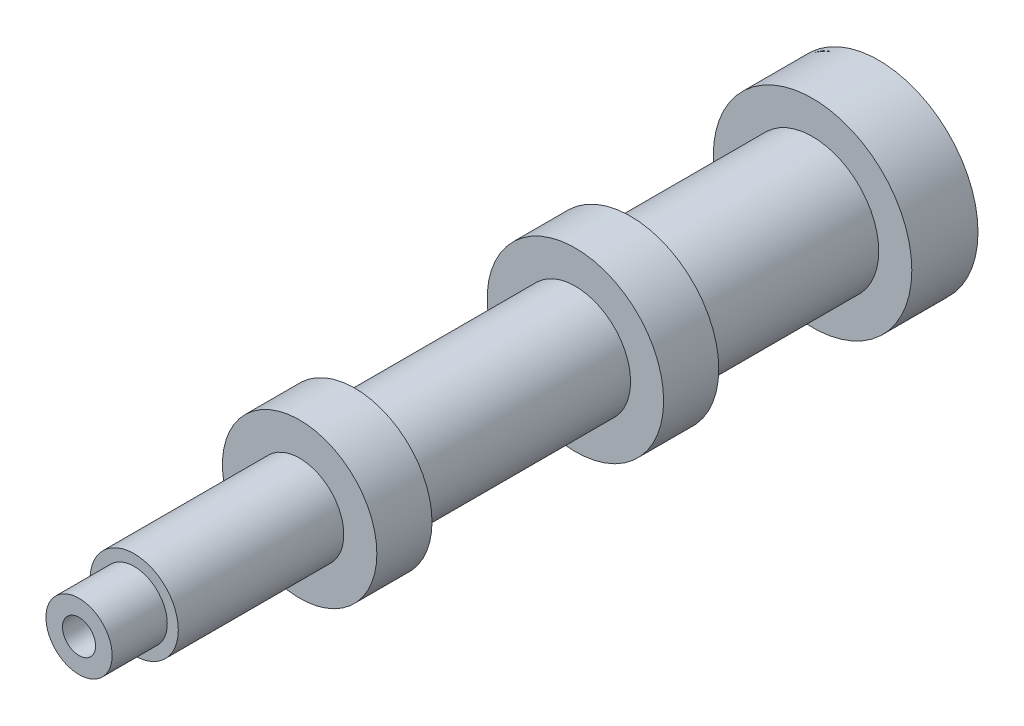
ISO-10303-21;
HEADER;
FILE_DESCRIPTION(('STEP AP214'),'2;1');
FILE_NAME('part.step','',(''),(''),'','','');
FILE_SCHEMA(('AUTOMOTIVE_DESIGN { 1 0 10303 214 1 1 1 1 }'));
ENDSEC;
DATA;
#1=APPLICATION_CONTEXT('core data for automotive mechanical design processes');
#2=APPLICATION_PROTOCOL_DEFINITION('international standard','automotive_design',2000,#1);
#3=PRODUCT_CONTEXT('',#1,'mechanical');
#4=PRODUCT('Part','Part','',(#3));
#5=PRODUCT_RELATED_PRODUCT_CATEGORY('part','',(#4));
#6=PRODUCT_DEFINITION_FORMATION('','',#4);
#7=PRODUCT_DEFINITION_CONTEXT('part definition',#1,'design');
#8=PRODUCT_DEFINITION('design','',#6,#7);
#9=PRODUCT_DEFINITION_SHAPE('','',#8);
#10=(LENGTH_UNIT() NAMED_UNIT(*) SI_UNIT(.MILLI.,.METRE.));
#11=(NAMED_UNIT(*) PLANE_ANGLE_UNIT() SI_UNIT($,.RADIAN.));
#12=(NAMED_UNIT(*) SI_UNIT($,.STERADIAN.) SOLID_ANGLE_UNIT());
#13=UNCERTAINTY_MEASURE_WITH_UNIT(LENGTH_MEASURE(1.E-05),#10,'distance_accuracy_value','');
#14=(GEOMETRIC_REPRESENTATION_CONTEXT(3) GLOBAL_UNCERTAINTY_ASSIGNED_CONTEXT((#13)) GLOBAL_UNIT_ASSIGNED_CONTEXT((#10,
#11,#12)) REPRESENTATION_CONTEXT('',''));
#15=CARTESIAN_POINT('',(0.,0.,0.));
#16=DIRECTION('',(0.,0.,1.));
#17=DIRECTION('',(1.,0.,0.));
#18=AXIS2_PLACEMENT_3D('',#15,#16,#17);
#19=CARTESIAN_POINT('',(0.,0.,95.));
#20=DIRECTION('',(0.,0.,1.));
#21=DIRECTION('',(1.,0.,0.));
#22=AXIS2_PLACEMENT_3D('',#19,#20,#21);
#23=PLANE('',#22);
#24=CARTESIAN_POINT('',(0.,0.,95.));
#25=DIRECTION('',(0.,0.,1.));
#26=DIRECTION('',(1.,0.,0.));
#27=AXIS2_PLACEMENT_3D('',#24,#25,#26);
#28=CIRCLE('',#27,14.);
#29=CARTESIAN_POINT('',(14.,0.,95.));
#30=VERTEX_POINT('',#29);
#31=EDGE_CURVE('E24',#30,#30,#28,.T.);
#32=ORIENTED_EDGE('',*,*,#31,.F.);
#33=EDGE_LOOP('',(#32));
#34=FACE_BOUND('',#33,.T.);
#35=CARTESIAN_POINT('',(0.,0.,95.));
#36=DIRECTION('',(0.,0.,1.));
#37=DIRECTION('',(1.,0.,0.));
#38=AXIS2_PLACEMENT_3D('',#35,#36,#37);
#39=CIRCLE('',#38,10.);
#40=CARTESIAN_POINT('',(10.,0.,95.));
#41=VERTEX_POINT('',#40);
#42=EDGE_CURVE('E41',#41,#41,#39,.T.);
#43=ORIENTED_EDGE('',*,*,#42,.T.);
#44=EDGE_LOOP('',(#43));
#45=FACE_BOUND('',#44,.T.);
#46=ADVANCED_FACE('F16',(#34,#45),#23,.F.);
#47=CARTESIAN_POINT('',(0.,0.,95.));
#48=DIRECTION('',(0.,0.,1.));
#49=DIRECTION('',(1.,0.,0.));
#50=AXIS2_PLACEMENT_3D('',#47,#48,#49);
#51=CYLINDRICAL_SURFACE('',#50,14.);
#52=ORIENTED_EDGE('',*,*,#31,.T.);
#53=DIRECTION('',(0.,0.,1.));
#54=VECTOR('',#53,1.);
#55=CARTESIAN_POINT('',(14.,0.,95.));
#56=LINE('',#55,#54);
#57=CARTESIAN_POINT('',(14.,0.,105.));
#58=VERTEX_POINT('',#57);
#59=EDGE_CURVE('E10',#30,#58,#56,.T.);
#60=ORIENTED_EDGE('',*,*,#59,.T.);
#61=CARTESIAN_POINT('',(0.,0.,105.));
#62=DIRECTION('',(0.,0.,1.));
#63=DIRECTION('',(1.,0.,0.));
#64=AXIS2_PLACEMENT_3D('',#61,#62,#63);
#65=CIRCLE('',#64,14.);
#66=EDGE_CURVE('E150',#58,#58,#65,.T.);
#67=ORIENTED_EDGE('',*,*,#66,.F.);
#68=ORIENTED_EDGE('',*,*,#59,.F.);
#69=EDGE_LOOP('',(#52,#60,#67,#68));
#70=FACE_BOUND('',#69,.T.);
#71=ADVANCED_FACE('F274',(#70),#51,.T.);
#72=CARTESIAN_POINT('',(0.,0.,55.));
#73=DIRECTION('',(0.,0.,1.));
#74=DIRECTION('',(1.,0.,0.));
#75=AXIS2_PLACEMENT_3D('',#72,#73,#74);
#76=CYLINDRICAL_SURFACE('',#75,10.);
#77=CARTESIAN_POINT('',(0.,0.,55.));
#78=DIRECTION('',(0.,0.,1.));
#79=DIRECTION('',(1.,0.,0.));
#80=AXIS2_PLACEMENT_3D('',#77,#78,#79);
#81=CIRCLE('',#80,10.);
#82=CARTESIAN_POINT('',(10.,0.,55.));
#83=VERTEX_POINT('',#82);
#84=EDGE_CURVE('E154',#83,#83,#81,.T.);
#85=ORIENTED_EDGE('',*,*,#84,.T.);
#86=DIRECTION('',(0.,0.,1.));
#87=VECTOR('',#86,1.);
#88=CARTESIAN_POINT('',(10.,0.,55.));
#89=LINE('',#88,#87);
#90=EDGE_CURVE('E153',#83,#41,#89,.T.);
#91=ORIENTED_EDGE('',*,*,#90,.T.);
#92=ORIENTED_EDGE('',*,*,#42,.F.);
#93=ORIENTED_EDGE('',*,*,#90,.F.);
#94=EDGE_LOOP('',(#85,#91,#92,#93));
#95=FACE_BOUND('',#94,.T.);
#96=ADVANCED_FACE('F281',(#95),#76,.T.);
#97=CARTESIAN_POINT('',(0.,0.,105.));
#98=DIRECTION('',(0.,0.,1.));
#99=DIRECTION('',(1.,0.,0.));
#100=AXIS2_PLACEMENT_3D('',#97,#98,#99);
#101=PLANE('',#100);
#102=CARTESIAN_POINT('',(0.,0.,105.));
#103=DIRECTION('',(0.,0.,1.));
#104=DIRECTION('',(1.,0.,0.));
#105=AXIS2_PLACEMENT_3D('',#102,#103,#104);
#106=CIRCLE('',#105,8.);
#107=CARTESIAN_POINT('',(8.,0.,105.));
#108=VERTEX_POINT('',#107);
#109=EDGE_CURVE('E245',#108,#108,#106,.T.);
#110=ORIENTED_EDGE('',*,*,#109,.F.);
#111=EDGE_LOOP('',(#110));
#112=FACE_BOUND('',#111,.T.);
#113=ORIENTED_EDGE('',*,*,#66,.T.);
#114=EDGE_LOOP('',(#113));
#115=FACE_BOUND('',#114,.T.);
#116=ADVANCED_FACE('F285',(#112,#115),#101,.T.);
#117=CARTESIAN_POINT('',(0.,0.,55.));
#118=DIRECTION('',(0.,0.,1.));
#119=DIRECTION('',(1.,0.,0.));
#120=AXIS2_PLACEMENT_3D('',#117,#118,#119);
#121=PLANE('',#120);
#122=ORIENTED_EDGE('',*,*,#84,.F.);
#123=EDGE_LOOP('',(#122));
#124=FACE_BOUND('',#123,.T.);
#125=CARTESIAN_POINT('',(0.,0.,55.));
#126=DIRECTION('',(0.,0.,1.));
#127=DIRECTION('',(1.,0.,0.));
#128=AXIS2_PLACEMENT_3D('',#125,#126,#127);
#129=CIRCLE('',#128,16.);
#130=CARTESIAN_POINT('',(16.,0.,55.));
#131=VERTEX_POINT('',#130);
#132=EDGE_CURVE('E250',#131,#131,#129,.T.);
#133=ORIENTED_EDGE('',*,*,#132,.T.);
#134=EDGE_LOOP('',(#133));
#135=FACE_BOUND('',#134,.T.);
#136=ADVANCED_FACE('F291',(#124,#135),#121,.T.);
#137=CARTESIAN_POINT('',(0.,0.,105.));
#138=DIRECTION('',(0.,0.,1.));
#139=DIRECTION('',(1.,0.,0.));
#140=AXIS2_PLACEMENT_3D('',#137,#138,#139);
#141=CYLINDRICAL_SURFACE('',#140,8.);
#142=ORIENTED_EDGE('',*,*,#109,.T.);
#143=DIRECTION('',(0.,0.,1.));
#144=VECTOR('',#143,1.);
#145=CARTESIAN_POINT('',(8.,0.,105.));
#146=LINE('',#145,#144);
#147=CARTESIAN_POINT('',(8.,0.,135.));
#148=VERTEX_POINT('',#147);
#149=EDGE_CURVE('E249',#108,#148,#146,.T.);
#150=ORIENTED_EDGE('',*,*,#149,.T.);
#151=CARTESIAN_POINT('',(0.,0.,135.));
#152=DIRECTION('',(0.,0.,1.));
#153=DIRECTION('',(1.,0.,0.));
#154=AXIS2_PLACEMENT_3D('',#151,#152,#153);
#155=CIRCLE('',#154,8.);
#156=EDGE_CURVE('E257',#148,#148,#155,.T.);
#157=ORIENTED_EDGE('',*,*,#156,.F.);
#158=ORIENTED_EDGE('',*,*,#149,.F.);
#159=EDGE_LOOP('',(#142,#150,#157,#158));
#160=FACE_BOUND('',#159,.T.);
#161=ADVANCED_FACE('F293',(#160),#141,.T.);
#162=CARTESIAN_POINT('',(0.,0.,45.));
#163=DIRECTION('',(0.,0.,1.));
#164=DIRECTION('',(1.,0.,0.));
#165=AXIS2_PLACEMENT_3D('',#162,#163,#164);
#166=CYLINDRICAL_SURFACE('',#165,16.);
#167=CARTESIAN_POINT('',(0.,0.,45.));
#168=DIRECTION('',(0.,0.,1.));
#169=DIRECTION('',(1.,0.,0.));
#170=AXIS2_PLACEMENT_3D('',#167,#168,#169);
#171=CIRCLE('',#170,16.);
#172=CARTESIAN_POINT('',(16.,0.,45.));
#173=VERTEX_POINT('',#172);
#174=EDGE_CURVE('E253',#173,#173,#171,.T.);
#175=ORIENTED_EDGE('',*,*,#174,.T.);
#176=DIRECTION('',(0.,0.,1.));
#177=VECTOR('',#176,1.);
#178=CARTESIAN_POINT('',(16.,0.,45.));
#179=LINE('',#178,#177);
#180=EDGE_CURVE('E261',#173,#131,#179,.T.);
#181=ORIENTED_EDGE('',*,*,#180,.T.);
#182=ORIENTED_EDGE('',*,*,#132,.F.);
#183=ORIENTED_EDGE('',*,*,#180,.F.);
#184=EDGE_LOOP('',(#175,#181,#182,#183));
#185=FACE_BOUND('',#184,.T.);
#186=ADVANCED_FACE('F296',(#185),#166,.T.);
#187=CARTESIAN_POINT('',(0.,0.,135.));
#188=DIRECTION('',(0.,0.,1.));
#189=DIRECTION('',(1.,0.,0.));
#190=AXIS2_PLACEMENT_3D('',#187,#188,#189);
#191=PLANE('',#190);
#192=CARTESIAN_POINT('',(0.,0.,135.));
#193=DIRECTION('',(0.,0.,1.));
#194=DIRECTION('',(1.,0.,0.));
#195=AXIS2_PLACEMENT_3D('',#192,#193,#194);
#196=CIRCLE('',#195,6.);
#197=CARTESIAN_POINT('',(6.,0.,135.));
#198=VERTEX_POINT('',#197);
#199=EDGE_CURVE('E240',#198,#198,#196,.T.);
#200=ORIENTED_EDGE('',*,*,#199,.F.);
#201=EDGE_LOOP('',(#200));
#202=FACE_BOUND('',#201,.T.);
#203=ORIENTED_EDGE('',*,*,#156,.T.);
#204=EDGE_LOOP('',(#203));
#205=FACE_BOUND('',#204,.T.);
#206=ADVANCED_FACE('F298',(#202,#205),#191,.T.);
#207=CARTESIAN_POINT('',(0.,0.,45.));
#208=DIRECTION('',(0.,0.,1.));
#209=DIRECTION('',(1.,0.,0.));
#210=AXIS2_PLACEMENT_3D('',#207,#208,#209);
#211=PLANE('',#210);
#212=ORIENTED_EDGE('',*,*,#174,.F.);
#213=EDGE_LOOP('',(#212));
#214=FACE_BOUND('',#213,.T.);
#215=CARTESIAN_POINT('',(0.,0.,45.));
#216=DIRECTION('',(0.,0.,1.));
#217=DIRECTION('',(1.,0.,0.));
#218=AXIS2_PLACEMENT_3D('',#215,#216,#217);
#219=CIRCLE('',#218,12.);
#220=CARTESIAN_POINT('',(12.,0.,45.));
#221=VERTEX_POINT('',#220);
#222=EDGE_CURVE('E237',#221,#221,#219,.T.);
#223=ORIENTED_EDGE('',*,*,#222,.T.);
#224=EDGE_LOOP('',(#223));
#225=FACE_BOUND('',#224,.T.);
#226=ADVANCED_FACE('F301',(#214,#225),#211,.F.);
#227=CARTESIAN_POINT('',(0.,0.,135.));
#228=DIRECTION('',(0.,0.,1.));
#229=DIRECTION('',(1.,0.,0.));
#230=AXIS2_PLACEMENT_3D('',#227,#228,#229);
#231=CYLINDRICAL_SURFACE('',#230,6.);
#232=ORIENTED_EDGE('',*,*,#199,.T.);
#233=DIRECTION('',(0.,0.,1.));
#234=VECTOR('',#233,1.);
#235=CARTESIAN_POINT('',(6.,0.,135.));
#236=LINE('',#235,#234);
#237=CARTESIAN_POINT('',(6.,0.,145.));
#238=VERTEX_POINT('',#237);
#239=EDGE_CURVE('E244',#198,#238,#236,.T.);
#240=ORIENTED_EDGE('',*,*,#239,.T.);
#241=CARTESIAN_POINT('',(0.,0.,145.));
#242=DIRECTION('',(0.,0.,1.));
#243=DIRECTION('',(1.,0.,0.));
#244=AXIS2_PLACEMENT_3D('',#241,#242,#243);
#245=CIRCLE('',#244,6.);
#246=EDGE_CURVE('E207',#238,#238,#245,.T.);
#247=ORIENTED_EDGE('',*,*,#246,.F.);
#248=ORIENTED_EDGE('',*,*,#239,.F.);
#249=EDGE_LOOP('',(#232,#240,#247,#248));
#250=FACE_BOUND('',#249,.T.);
#251=ADVANCED_FACE('F310',(#250),#231,.T.);
#252=CARTESIAN_POINT('',(0.,0.,12.));
#253=DIRECTION('',(0.,0.,1.));
#254=DIRECTION('',(1.,0.,0.));
#255=AXIS2_PLACEMENT_3D('',#252,#253,#254);
#256=CYLINDRICAL_SURFACE('',#255,12.);
#257=CARTESIAN_POINT('',(0.,0.,12.));
#258=DIRECTION('',(0.,0.,1.));
#259=DIRECTION('',(1.,0.,0.));
#260=AXIS2_PLACEMENT_3D('',#257,#258,#259);
#261=CIRCLE('',#260,12.);
#262=CARTESIAN_POINT('',(12.,0.,12.));
#263=VERTEX_POINT('',#262);
#264=EDGE_CURVE('E145',#263,#263,#261,.T.);
#265=ORIENTED_EDGE('',*,*,#264,.T.);
#266=DIRECTION('',(0.,0.,1.));
#267=VECTOR('',#266,1.);
#268=CARTESIAN_POINT('',(12.,0.,12.));
#269=LINE('',#268,#267);
#270=EDGE_CURVE('E144',#263,#221,#269,.T.);
#271=ORIENTED_EDGE('',*,*,#270,.T.);
#272=ORIENTED_EDGE('',*,*,#222,.F.);
#273=ORIENTED_EDGE('',*,*,#270,.F.);
#274=EDGE_LOOP('',(#265,#271,#272,#273));
#275=FACE_BOUND('',#274,.T.);
#276=ADVANCED_FACE('F306',(#275),#256,.T.);
#277=CARTESIAN_POINT('',(0.,0.,145.));
#278=DIRECTION('',(0.,0.,1.));
#279=DIRECTION('',(1.,0.,0.));
#280=AXIS2_PLACEMENT_3D('',#277,#278,#279);
#281=PLANE('',#280);
#282=CARTESIAN_POINT('',(0.,0.,145.));
#283=DIRECTION('',(0.,0.,-1.));
#284=DIRECTION('',(1.,0.,0.));
#285=AXIS2_PLACEMENT_3D('',#282,#283,#284);
#286=CIRCLE('',#285,3.);
#287=CARTESIAN_POINT('',(3.,0.,145.));
#288=VERTEX_POINT('',#287);
#289=EDGE_CURVE('E177',#288,#288,#286,.T.);
#290=ORIENTED_EDGE('',*,*,#289,.T.);
#291=EDGE_LOOP('',(#290));
#292=FACE_BOUND('',#291,.T.);
#293=ORIENTED_EDGE('',*,*,#246,.T.);
#294=EDGE_LOOP('',(#293));
#295=FACE_BOUND('',#294,.T.);
#296=ADVANCED_FACE('F309',(#292,#295),#281,.T.);
#297=CARTESIAN_POINT('',(0.866,0.,0.25));
#298=CARTESIAN_POINT('',(3.325404599366,0.249357089273,0.264408546602));
#299=CARTESIAN_POINT('',(5.700419874504,2.040283146448,0.328270355823));
#300=CARTESIAN_POINT('',(7.202499126626,5.343010474638,0.441118915282));
#301=CARTESIAN_POINT('',(7.01074209718,9.716845942879,0.60349053073));
#302=CARTESIAN_POINT('',(4.593939198478,14.276817473699,0.816206180487));
#303=CARTESIAN_POINT('',(-0.102550899965,17.913535012092,1.074612182808));
#304=CARTESIAN_POINT('',(-6.580507598828,19.515992987312,1.38795272935));
#305=CARTESIAN_POINT('',(-13.73261197323,18.391018072137,1.744117260091));
#306=CARTESIAN_POINT('',(-20.36440293828,14.417454403169,2.153596373827));
#307=CARTESIAN_POINT('',(-25.30009353286,8.045503427873,2.609563859666));
#308=CARTESIAN_POINT('',(-27.75731656931,0.14659504899,3.114644462919));
#309=CARTESIAN_POINT('',(-30.21453947563,-7.75231333143,3.619725041409));
#310=CARTESIAN_POINT('',(-30.18659827237,-17.17944352539,4.172643110485));
#311=CARTESIAN_POINT('',(-26.8904021064,-27.26118644871,4.775770759843));
#312=CARTESIAN_POINT('',(-19.84123063084,-36.7208959415,5.422824483013));
#313=CARTESIAN_POINT('',(-9.213857143045,-43.99568548862,6.123921110447));
#314=CARTESIAN_POINT('',(4.188257334063,-47.59354809044,6.864493363616));
#315=CARTESIAN_POINT('',(18.788959875935,-46.45080124715,7.661078458959));
#316=CARTESIAN_POINT('',(32.654826680576,-40.27314148562,8.495574655791));
#317=CARTESIAN_POINT('',(43.937673917939,-29.66135145917,9.383957178829));
#318=CARTESIAN_POINT('',(51.179344386128,-15.88165860823,10.31336262877));
#319=CARTESIAN_POINT('',(53.632298421711,-0.622569447803,11.290723648826));
#320=CARTESIAN_POINT('',(-0.866,0.,0.25));
#321=CARTESIAN_POINT('',(1.593404599366,-0.243327472845,0.232796748077));
#322=CARTESIAN_POINT('',(4.123218443737,1.054824595048,0.265124481656));
#323=CARTESIAN_POINT('',(5.934946819559,3.919327925388,0.346289574513));
#324=CARTESIAN_POINT('',(6.186042431226,7.962912985747,0.477260276065));
#325=CARTESIAN_POINT('',(4.302634736307,12.346367592205,0.658272755214));
#326=CARTESIAN_POINT('',(0.170397629342,15.984093344311,0.885456887488));
#327=CARTESIAN_POINT('',(-5.777237565701,17.764658304551,1.167178593211));
#328=CARTESIAN_POINT('',(-12.49134131593,16.968410976708,1.492229851139));
#329=CARTESIAN_POINT('',(-18.81856371438,13.428422275192,1.870406726744));
#330=CARTESIAN_POINT('',(-23.6027687182,7.541328506007,2.295324311294));
#331=CARTESIAN_POINT('',(-26.06020162807,0.125190722114,2.769439116756));
#332=CARTESIAN_POINT('',(-28.51763440747,-7.290947063213,3.243553899123));
#333=CARTESIAN_POINT('',(-28.6415799861,-16.23730808489,3.765676216382));
#334=CARTESIAN_POINT('',(-25.64760643255,-25.89364577387,4.33800959775));
#335=CARTESIAN_POINT('',(-19.02835018552,-35.03525412492,4.954712356826));
#336=CARTESIAN_POINT('',(-8.915940283997,-42.14167680371,5.625207202083));
#337=CARTESIAN_POINT('',(3.944706327038,-45.74315783892,6.335821828426));
#338=CARTESIAN_POINT('',(18.039419642024,-44.77237397963,7.102234208787));
#339=CARTESIAN_POINT('',(31.489869188862,-38.90905125676,7.90709234695));
#340=CARTESIAN_POINT('',(42.485458946278,-28.70853131111,8.765824389243));
#341=CARTESIAN_POINT('',(49.585056984975,-15.38631971754,9.665965316284));
#342=CARTESIAN_POINT('',(52.03842470075,-0.58062440705,10.614239225363));
#343=(BOUNDED_SURFACE() B_SPLINE_SURFACE(1,11,((#297,#298,#299,#300,#301,#302,#303,#304,#305,
#306,#307,#308,#309,#310,#311,#312,#313,#314,#315,#316,#317,#318,#319),(#320,#321,#322,#323,
#324,#325,#326,#327,#328,#329,#330,#331,#332,#333,#334,#335,#336,#337,#338,#339,#340,#341,
#342)),.UNSPECIFIED.,.F.,.F.,.F.) B_SPLINE_SURFACE_WITH_KNOTS((2,2),(12,11,12),(0.,1.732),(0.,
0.5,1.),.UNSPECIFIED.) GEOMETRIC_REPRESENTATION_ITEM() RATIONAL_B_SPLINE_SURFACE(((1.,1.,1.,1.,
1.,1.,1.,1.,1.,1.,1.,1.,1.,1.,1.,1.,1.,1.,1.,1.,1.,1.,1.),(1.,1.,1.,1.,1.,1.,1.,1.,1.,1.,1.,1.,
1.,1.,1.,1.,1.,1.,1.,1.,1.,1.,1.))) REPRESENTATION_ITEM('') SURFACE());
#344=CARTESIAN_POINT('',(0.866,0.,0.25));
#345=CARTESIAN_POINT('',(3.325404599366,0.249357089273,0.264408546602));
#346=CARTESIAN_POINT('',(5.700419874504,2.040283146448,0.328270355823));
#347=CARTESIAN_POINT('',(7.202499126627,5.343010474638,0.441118915282));
#348=CARTESIAN_POINT('',(7.010742097178,9.716845942879,0.60349053073));
#349=CARTESIAN_POINT('',(4.59393919848,14.276817473699,0.816206180487));
#350=CARTESIAN_POINT('',(-0.102550899967,17.913535012093,1.074612182808));
#351=CARTESIAN_POINT('',(-6.580507598827,19.515992987312,1.38795272935));
#352=CARTESIAN_POINT('',(-13.73261197323,18.391018072137,1.744117260091));
#353=CARTESIAN_POINT('',(-20.36440293828,14.417454403169,2.153596373827));
#354=CARTESIAN_POINT('',(-25.30009353286,8.045503427873,2.609563859666));
#355=CARTESIAN_POINT('',(-27.75731656931,0.14659504899,3.114644462919));
#356=CARTESIAN_POINT('',(-30.21453947563,-7.75231333143,3.619725041409));
#357=CARTESIAN_POINT('',(-30.18659827237,-17.17944352539,4.172643110485));
#358=CARTESIAN_POINT('',(-26.8904021064,-27.26118644871,4.775770759843));
#359=CARTESIAN_POINT('',(-19.84123063084,-36.7208959415,5.422824483013));
#360=CARTESIAN_POINT('',(-9.213857143041,-43.99568548862,6.123921110447));
#361=CARTESIAN_POINT('',(4.188257334058,-47.59354809044,6.864493363616));
#362=CARTESIAN_POINT('',(18.788959875939,-46.45080124715,7.661078458959));
#363=CARTESIAN_POINT('',(32.654826680574,-40.27314148562,8.495574655791));
#364=CARTESIAN_POINT('',(43.937673917939,-29.66135145917,9.383957178829));
#365=CARTESIAN_POINT('',(51.179344386128,-15.88165860823,10.31336262877));
#366=CARTESIAN_POINT('',(53.632298421711,-0.622569447803,11.290723648826));
#367=(BOUNDED_CURVE() B_SPLINE_CURVE(11,(#344,#345,#346,#347,#348,#349,#350,#351,#352,#353,#354,
#355,#356,#357,#358,#359,#360,#361,#362,#363,#364,#365,#366),.UNSPECIFIED.,.F.,
.F.) B_SPLINE_CURVE_WITH_KNOTS((12,11,12),(0.,0.5,1.),
.UNSPECIFIED.) CURVE() GEOMETRIC_REPRESENTATION_ITEM() RATIONAL_B_SPLINE_CURVE((1.,1.,1.,1.,1.,
1.,1.,1.,1.,1.,1.,1.,1.,1.,1.,1.,1.,1.,1.,1.,1.,1.,1.)) REPRESENTATION_ITEM(''));
#368=CARTESIAN_POINT('',(2.908116886317,0.736787741154,0.279420080497));
#369=VERTEX_POINT('',#368);
#370=CARTESIAN_POINT('',(-7.352659015679,16.429802354233,1.443339557088));
#371=VERTEX_POINT('',#370);
#372=EDGE_CURVE('E208',#369,#371,#367,.T.);
#373=CARTESIAN_POINT('',(2.701352690442,1.304873036674,0.278448830862));
#374=CARTESIAN_POINT('',(2.717827447599,1.270766937217,0.279205525357));
#375=CARTESIAN_POINT('',(2.733726496203,1.23638673736,0.279846272611));
#376=CARTESIAN_POINT('',(2.749042988242,1.201747239516,0.280371041912));
#377=CARTESIAN_POINT('',(2.778497731849,1.131982305169,0.281188550283));
#378=CARTESIAN_POINT('',(2.792636063601,1.09685690059,0.281481305089));
#379=CARTESIAN_POINT('',(2.806179788068,1.061502526762,0.281658050968));
#380=CARTESIAN_POINT('',(2.832066816605,0.990368625356,0.281779493175));
#381=CARTESIAN_POINT('',(2.844410183934,0.954589118975,0.281724201668));
#382=CARTESIAN_POINT('',(2.856148477415,0.918611591278,0.281552884878));
#383=CARTESIAN_POINT('',(2.878405605504,0.846293355192,0.280978204774));
#384=CARTESIAN_POINT('',(2.888924486748,0.809952659396,0.28057485025));
#385=CARTESIAN_POINT('',(2.898829449153,0.773445453191,0.280055472486));
#386=CARTESIAN_POINT('',(2.908116886317,0.736787741154,0.279420080497));
#387=(BOUNDED_CURVE() B_SPLINE_CURVE(4,(#373,#374,#375,#376,#377,#378,#379,#380,#381,#382,#383,
#384,#385,#386),.UNSPECIFIED.,.F.,.F.) B_SPLINE_CURVE_WITH_KNOTS((5,3,3,3,5),(0.,0.250021547921,
0.500026199695,0.75001780813,1.),
.UNSPECIFIED.) CURVE() GEOMETRIC_REPRESENTATION_ITEM() RATIONAL_B_SPLINE_CURVE((1.,1.,1.,1.,1.,
1.,1.,1.,1.,1.,1.,1.,1.,1.)) REPRESENTATION_ITEM(''));
#388=CARTESIAN_POINT('',(2.701352690442,1.304873036674,0.278448830862));
#389=VERTEX_POINT('',#388);
#390=EDGE_CURVE('E180',#389,#369,#387,.T.);
#391=CARTESIAN_POINT('',(-0.866,0.,0.25));
#392=CARTESIAN_POINT('',(1.593404599366,-0.243327472845,0.232796748077));
#393=CARTESIAN_POINT('',(4.123218443737,1.054824595048,0.265124481656));
#394=CARTESIAN_POINT('',(5.934946819559,3.919327925388,0.346289574513));
#395=CARTESIAN_POINT('',(6.186042431226,7.962912985747,0.477260276065));
#396=CARTESIAN_POINT('',(4.302634736307,12.346367592205,0.658272755214));
#397=CARTESIAN_POINT('',(0.170397629342,15.984093344311,0.885456887488));
#398=CARTESIAN_POINT('',(-5.777237565701,17.764658304551,1.167178593211));
#399=CARTESIAN_POINT('',(-12.49134131593,16.968410976708,1.492229851139));
#400=CARTESIAN_POINT('',(-18.81856371438,13.428422275192,1.870406726744));
#401=CARTESIAN_POINT('',(-23.6027687182,7.541328506007,2.295324311294));
#402=CARTESIAN_POINT('',(-26.06020162807,0.125190722114,2.769439116756));
#403=CARTESIAN_POINT('',(-28.51763440747,-7.290947063213,3.243553899123));
#404=CARTESIAN_POINT('',(-28.6415799861,-16.23730808489,3.765676216382));
#405=CARTESIAN_POINT('',(-25.64760643255,-25.89364577387,4.33800959775));
#406=CARTESIAN_POINT('',(-19.02835018552,-35.03525412492,4.954712356826));
#407=CARTESIAN_POINT('',(-8.915940283997,-42.14167680371,5.625207202083));
#408=CARTESIAN_POINT('',(3.944706327038,-45.74315783892,6.335821828426));
#409=CARTESIAN_POINT('',(18.039419642024,-44.77237397963,7.102234208787));
#410=CARTESIAN_POINT('',(31.489869188862,-38.90905125676,7.90709234695));
#411=CARTESIAN_POINT('',(42.485458946278,-28.70853131111,8.765824389243));
#412=CARTESIAN_POINT('',(49.585056984975,-15.38631971754,9.665965316284));
#413=CARTESIAN_POINT('',(52.03842470075,-0.58062440705,10.614239225363));
#414=(BOUNDED_CURVE() B_SPLINE_CURVE(11,(#391,#392,#393,#394,#395,#396,#397,#398,#399,#400,#401,
#402,#403,#404,#405,#406,#407,#408,#409,#410,#411,#412,#413),.UNSPECIFIED.,.F.,
.F.) B_SPLINE_CURVE_WITH_KNOTS((12,11,12),(0.,0.5,1.),
.UNSPECIFIED.) CURVE() GEOMETRIC_REPRESENTATION_ITEM() RATIONAL_B_SPLINE_CURVE((1.,1.,1.,1.,1.,
1.,1.,1.,1.,1.,1.,1.,1.,1.,1.,1.,1.,1.,1.,1.,1.,1.,1.)) REPRESENTATION_ITEM(''));
#415=CARTESIAN_POINT('',(-10.48231715835,14.632874871047,1.442076776995));
#416=VERTEX_POINT('',#415);
#417=EDGE_CURVE('E202',#389,#416,#414,.T.);
#418=CARTESIAN_POINT('',(-10.48231715835,14.632874871047,1.442076776995));
#419=CARTESIAN_POINT('',(-10.29876847542,14.764360688116,1.442857747662));
#420=CARTESIAN_POINT('',(-10.11301516237,14.892780676532,1.443521622585));
#421=CARTESIAN_POINT('',(-9.925134196251,15.018079060893,1.444068454467));
#422=CARTESIAN_POINT('',(-9.545212519619,15.262370056807,1.444928280669));
#423=CARTESIAN_POINT('',(-9.35317042169,15.381360539708,1.445241196298));
#424=CARTESIAN_POINT('',(-9.159158804227,15.497123599424,1.445437094197));
#425=CARTESIAN_POINT('',(-8.767297841209,15.722135715054,1.445594983304));
#426=CARTESIAN_POINT('',(-8.569447264477,15.831382657378,1.445556898827));
#427=CARTESIAN_POINT('',(-8.369790702598,15.937304469251,1.44540182422));
#428=CARTESIAN_POINT('',(-7.96697253703,16.142442519422,1.444857713097));
#429=CARTESIAN_POINT('',(-7.763809853079,16.241656668891,1.444468603882));
#430=CARTESIAN_POINT('',(-7.559009695049,16.33745637524,1.443962534776));
#431=CARTESIAN_POINT('',(-7.352659015679,16.429802354233,1.443339557088));
#432=(BOUNDED_CURVE() B_SPLINE_CURVE(4,(#418,#419,#420,#421,#422,#423,#424,#425,#426,#427,#428,
#429,#430,#431),.UNSPECIFIED.,.F.,.F.) B_SPLINE_CURVE_WITH_KNOTS((5,3,3,3,5),(0.,0.249877110924,
0.49983826243,0.74988027765,1.),
.UNSPECIFIED.) CURVE() GEOMETRIC_REPRESENTATION_ITEM() RATIONAL_B_SPLINE_CURVE((1.,1.,1.,1.,1.,
1.,1.,1.,1.,1.,1.,1.,1.,1.)) REPRESENTATION_ITEM(''));
#433=EDGE_CURVE('E170',#416,#371,#432,.T.);
#434=ORIENTED_EDGE('',*,*,#372,.F.);
#435=ORIENTED_EDGE('',*,*,#390,.F.);
#436=ORIENTED_EDGE('',*,*,#417,.T.);
#437=ORIENTED_EDGE('',*,*,#433,.T.);
#438=EDGE_LOOP('',(#434,#435,#436,#437));
#439=FACE_BOUND('',#438,.T.);
#440=ADVANCED_FACE('F314',(#439),#343,.T.);
#441=CARTESIAN_POINT('',(-0.866,0.,0.25));
#442=CARTESIAN_POINT('',(1.593404599366,-0.243327472845,0.232796748077));
#443=CARTESIAN_POINT('',(4.123218443737,1.054824595048,0.265124481656));
#444=CARTESIAN_POINT('',(5.934946819559,3.919327925388,0.346289574513));
#445=CARTESIAN_POINT('',(6.186042431226,7.962912985747,0.477260276065));
#446=CARTESIAN_POINT('',(4.302634736307,12.346367592205,0.658272755214));
#447=CARTESIAN_POINT('',(0.170397629342,15.984093344311,0.885456887488));
#448=CARTESIAN_POINT('',(-5.777237565701,17.764658304551,1.167178593211));
#449=CARTESIAN_POINT('',(-12.49134131593,16.968410976708,1.492229851139));
#450=CARTESIAN_POINT('',(-18.81856371438,13.428422275192,1.870406726744));
#451=CARTESIAN_POINT('',(-23.6027687182,7.541328506007,2.295324311294));
#452=CARTESIAN_POINT('',(-26.06020162807,0.125190722114,2.769439116756));
#453=CARTESIAN_POINT('',(-28.51763440747,-7.290947063213,3.243553899123));
#454=CARTESIAN_POINT('',(-28.6415799861,-16.23730808489,3.765676216382));
#455=CARTESIAN_POINT('',(-25.64760643255,-25.89364577387,4.33800959775));
#456=CARTESIAN_POINT('',(-19.02835018552,-35.03525412492,4.954712356826));
#457=CARTESIAN_POINT('',(-8.915940283997,-42.14167680371,5.625207202083));
#458=CARTESIAN_POINT('',(3.944706327038,-45.74315783892,6.335821828426));
#459=CARTESIAN_POINT('',(18.039419642024,-44.77237397963,7.102234208787));
#460=CARTESIAN_POINT('',(31.489869188862,-38.90905125676,7.90709234695));
#461=CARTESIAN_POINT('',(42.485458946278,-28.70853131111,8.765824389243));
#462=CARTESIAN_POINT('',(49.585056984975,-15.38631971754,9.665965316284));
#463=CARTESIAN_POINT('',(52.03842470075,-0.58062440705,10.614239225363));
#464=CARTESIAN_POINT('',(0.,0.,0.));
#465=CARTESIAN_POINT('',(2.46396750331,0.003014973546178,-0.001397352660377));
#466=CARTESIAN_POINT('',(4.92093364488,1.550414434125,0.04678902714611));
#467=CARTESIAN_POINT('',(6.580914703942,4.63974468426,0.143978618419));
#468=CARTESIAN_POINT('',(6.61064458279,8.856258830851,0.290923906717));
#469=CARTESIAN_POINT('',(4.456558622077,13.336261937659,0.488156054357));
#470=CARTESIAN_POINT('',(0.03401797974281,16.980229011557,0.731403096622));
#471=CARTESIAN_POINT('',(-6.190287659785,18.674880436487,1.02948884041));
#472=CARTESIAN_POINT('',(-13.13623571368,17.712495893633,1.370729882018));
#473=CARTESIAN_POINT('',(-19.62774657803,13.948768613953,1.765290282158));
#474=CARTESIAN_POINT('',(-24.49670021463,7.807901164109,2.206551012341));
#475=CARTESIAN_POINT('',(-26.95858666075,0.136203861995,2.6970578774));
#476=CARTESIAN_POINT('',(-29.42047297633,-7.535493441606,3.187564718482));
#477=CARTESIAN_POINT('',(-29.46857388209,-16.73924491434,3.72608251477));
#478=CARTESIAN_POINT('',(-26.31767760185,-26.62655385807,4.314903783757));
#479=CARTESIAN_POINT('',(-19.47082545137,-35.94443016859,4.947953466275));
#480=CARTESIAN_POINT('',(-9.081753686112,-43.14834842406,5.635021366143));
#481=CARTESIAN_POINT('',(4.073913817917,-46.75468861046,6.36195903437));
#482=CARTESIAN_POINT('',(18.448157111931,-45.69598145315,7.144906312516));
#483=CARTESIAN_POINT('',(32.13157411634,-39.66436871136,7.966101382129));
#484=CARTESIAN_POINT('',(43.291394284482,-29.2389875035,8.841276564166));
#485=CARTESIAN_POINT('',(50.475295485601,-15.66299657942,9.757743058113));
#486=CARTESIAN_POINT('',(52.933006541522,-0.602828400154,10.72234247625));
#487=(BOUNDED_SURFACE() B_SPLINE_SURFACE(1,11,((#441,#442,#443,#444,#445,#446,#447,#448,#449,
#450,#451,#452,#453,#454,#455,#456,#457,#458,#459,#460,#461,#462,#463),(#464,#465,#466,#467,
#468,#469,#470,#471,#472,#473,#474,#475,#476,#477,#478,#479,#480,#481,#482,#483,#484,#485,
#486)),.UNSPECIFIED.,.F.,.F.,.F.) B_SPLINE_SURFACE_WITH_KNOTS((2,2),(12,11,12),(0.,
0.901363411727),(0.,0.5,1.),
.UNSPECIFIED.) GEOMETRIC_REPRESENTATION_ITEM() RATIONAL_B_SPLINE_SURFACE(((1.,1.,1.,1.,1.,1.,1.,
1.,1.,1.,1.,1.,1.,1.,1.,1.,1.,1.,1.,1.,1.,1.,1.),(1.,1.,1.,1.,1.,1.,1.,1.,1.,1.,1.,1.,1.,1.,1.,
1.,1.,1.,1.,1.,1.,1.,1.))) REPRESENTATION_ITEM('') SURFACE());
#488=CARTESIAN_POINT('',(2.819786030167,1.024112661808,0.03166005500576));
#489=CARTESIAN_POINT('',(2.813298247135,1.041976087036,0.04725409004852));
#490=CARTESIAN_POINT('',(2.806655936033,1.059794736987,0.06282206775934));
#491=CARTESIAN_POINT('',(2.799859415041,1.077566547821,0.07836394144558));
#492=CARTESIAN_POINT('',(2.785962546143,1.113002560438,0.109386802672));
#493=CARTESIAN_POINT('',(2.778862368429,1.130666816357,0.124867819143));
#494=CARTESIAN_POINT('',(2.771608897681,1.148280165845,0.140322667232));
#495=CARTESIAN_POINT('',(2.75680031051,1.183391257599,0.17117142741));
#496=CARTESIAN_POINT('',(2.749245362601,1.200889058285,0.186565368397));
#497=CARTESIAN_POINT('',(2.741538146639,1.218331901287,0.201933076765));
#498=CARTESIAN_POINT('',(2.725824462204,1.253094023868,0.232607509114));
#499=CARTESIAN_POINT('',(2.717818160424,1.27041336609,0.247914261955));
#500=CARTESIAN_POINT('',(2.709660723634,1.287673717519,0.263194718032));
#501=CARTESIAN_POINT('',(2.701352690442,1.304873036674,0.278448830862));
#502=(BOUNDED_CURVE() B_SPLINE_CURVE(4,(#488,#489,#490,#491,#492,#493,#494,#495,#496,#497,#498,
#499,#500,#501),.UNSPECIFIED.,.F.,.F.) B_SPLINE_CURVE_WITH_KNOTS((5,3,3,3,5),(0.,0.250207079192,
0.500275720717,0.750206495864,1.),
.UNSPECIFIED.) CURVE() GEOMETRIC_REPRESENTATION_ITEM() RATIONAL_B_SPLINE_CURVE((1.,1.,1.,1.,1.,
1.,1.,1.,1.,1.,1.,1.,1.,1.)) REPRESENTATION_ITEM(''));
#503=CARTESIAN_POINT('',(2.819786030167,1.024112661808,0.03166005500576));
#504=VERTEX_POINT('',#503);
#505=EDGE_CURVE('E149',#504,#389,#502,.T.);
#506=CARTESIAN_POINT('',(0.,0.,0.));
#507=CARTESIAN_POINT('',(2.46396750331,0.003014973546178,-0.001397352660377));
#508=CARTESIAN_POINT('',(4.92093364488,1.550414434125,0.04678902714611));
#509=CARTESIAN_POINT('',(6.580914703942,4.63974468426,0.143978618419));
#510=CARTESIAN_POINT('',(6.61064458279,8.856258830851,0.290923906717));
#511=CARTESIAN_POINT('',(4.456558622077,13.336261937659,0.488156054357));
#512=CARTESIAN_POINT('',(0.03401797974281,16.980229011557,0.731403096622));
#513=CARTESIAN_POINT('',(-6.190287659785,18.674880436487,1.02948884041));
#514=CARTESIAN_POINT('',(-13.13623571368,17.712495893633,1.370729882018));
#515=CARTESIAN_POINT('',(-19.62774657803,13.948768613953,1.765290282158));
#516=CARTESIAN_POINT('',(-24.49670021463,7.807901164109,2.206551012341));
#517=CARTESIAN_POINT('',(-26.95858666075,0.136203861995,2.6970578774));
#518=CARTESIAN_POINT('',(-29.42047297633,-7.535493441606,3.187564718482));
#519=CARTESIAN_POINT('',(-29.46857388209,-16.73924491434,3.72608251477));
#520=CARTESIAN_POINT('',(-26.31767760185,-26.62655385807,4.314903783757));
#521=CARTESIAN_POINT('',(-19.47082545137,-35.94443016859,4.947953466275));
#522=CARTESIAN_POINT('',(-9.081753686112,-43.14834842406,5.635021366143));
#523=CARTESIAN_POINT('',(4.073913817917,-46.75468861046,6.36195903437));
#524=CARTESIAN_POINT('',(18.448157111931,-45.69598145315,7.144906312516));
#525=CARTESIAN_POINT('',(32.13157411634,-39.66436871136,7.966101382129));
#526=CARTESIAN_POINT('',(43.291394284482,-29.2389875035,8.841276564166));
#527=CARTESIAN_POINT('',(50.475295485601,-15.66299657942,9.757743058113));
#528=CARTESIAN_POINT('',(52.933006541522,-0.602828400154,10.72234247625));
#529=(BOUNDED_CURVE() B_SPLINE_CURVE(11,(#506,#507,#508,#509,#510,#511,#512,#513,#514,#515,#516,
#517,#518,#519,#520,#521,#522,#523,#524,#525,#526,#527,#528),.UNSPECIFIED.,.F.,
.F.) B_SPLINE_CURVE_WITH_KNOTS((12,11,12),(0.,0.5,1.),
.UNSPECIFIED.) CURVE() GEOMETRIC_REPRESENTATION_ITEM() RATIONAL_B_SPLINE_CURVE((1.,1.,1.,1.,1.,
1.,1.,1.,1.,1.,1.,1.,1.,1.,1.,1.,1.,1.,1.,1.,1.,1.,1.)) REPRESENTATION_ITEM(''));
#530=CARTESIAN_POINT('',(-8.902513901431,15.64433591543,1.193289779656));
#531=VERTEX_POINT('',#530);
#532=EDGE_CURVE('E148',#504,#531,#529,.T.);
#533=CARTESIAN_POINT('',(-8.902513901431,15.64433591543,1.193289779656));
#534=CARTESIAN_POINT('',(-9.004331439796,15.586395964792,1.209017583449));
#535=CARTESIAN_POINT('',(-9.105656772485,15.527566452767,1.224714009596));
#536=CARTESIAN_POINT('',(-9.206478124586,15.467853532943,1.240379064849));
#537=CARTESIAN_POINT('',(-9.407131369048,15.346648598698,1.27165295289));
#538=CARTESIAN_POINT('',(-9.506962832589,15.285155854084,1.287261759586));
#539=CARTESIAN_POINT('',(-9.606266633016,15.222791914071,1.302839182919));
#540=CARTESIAN_POINT('',(-9.803836780554,15.096309086401,1.333937700783));
#541=CARTESIAN_POINT('',(-9.902102682379,15.032189483985,1.349458769393));
#542=CARTESIAN_POINT('',(-9.999817521471,14.967211551165,1.364948442479));
#543=CARTESIAN_POINT('',(-10.19416231265,14.835526216719,1.395871354012));
#544=CARTESIAN_POINT('',(-10.29079180354,14.768818116219,1.411304566711));
#545=CARTESIAN_POINT('',(-10.38684713348,14.701265196841,1.426706372037));
#546=CARTESIAN_POINT('',(-10.48231715835,14.632874871047,1.442076776995));
#547=(BOUNDED_CURVE() B_SPLINE_CURVE(4,(#533,#534,#535,#536,#537,#538,#539,#540,#541,#542,#543,
#544,#545,#546),.UNSPECIFIED.,.F.,.F.) B_SPLINE_CURVE_WITH_KNOTS((5,3,3,3,5),(0.,0.249844730551,
0.499793429978,0.749845416956,1.),
.UNSPECIFIED.) CURVE() GEOMETRIC_REPRESENTATION_ITEM() RATIONAL_B_SPLINE_CURVE((1.,1.,1.,1.,1.,
1.,1.,1.,1.,1.,1.,1.,1.,1.)) REPRESENTATION_ITEM(''));
#548=EDGE_CURVE('E187',#531,#416,#547,.T.);
#549=ORIENTED_EDGE('',*,*,#417,.F.);
#550=ORIENTED_EDGE('',*,*,#505,.F.);
#551=ORIENTED_EDGE('',*,*,#532,.T.);
#552=ORIENTED_EDGE('',*,*,#548,.T.);
#553=EDGE_LOOP('',(#549,#550,#551,#552));
#554=FACE_BOUND('',#553,.T.);
#555=ADVANCED_FACE('F316',(#554),#487,.T.);
#556=CARTESIAN_POINT('',(0.,0.,0.));
#557=CARTESIAN_POINT('',(2.46396750331,0.003014973546178,-0.001397352660377));
#558=CARTESIAN_POINT('',(4.92093364488,1.550414434125,0.04678902714611));
#559=CARTESIAN_POINT('',(6.580914703942,4.63974468426,0.143978618419));
#560=CARTESIAN_POINT('',(6.61064458279,8.856258830851,0.290923906717));
#561=CARTESIAN_POINT('',(4.456558622077,13.336261937659,0.488156054357));
#562=CARTESIAN_POINT('',(0.03401797974281,16.980229011557,0.731403096622));
#563=CARTESIAN_POINT('',(-6.190287659785,18.674880436487,1.02948884041));
#564=CARTESIAN_POINT('',(-13.13623571368,17.712495893633,1.370729882018));
#565=CARTESIAN_POINT('',(-19.62774657803,13.948768613953,1.765290282158));
#566=CARTESIAN_POINT('',(-24.49670021463,7.807901164109,2.206551012341));
#567=CARTESIAN_POINT('',(-26.95858666075,0.136203861995,2.6970578774));
#568=CARTESIAN_POINT('',(-29.42047297633,-7.535493441606,3.187564718482));
#569=CARTESIAN_POINT('',(-29.46857388209,-16.73924491434,3.72608251477));
#570=CARTESIAN_POINT('',(-26.31767760185,-26.62655385807,4.314903783757));
#571=CARTESIAN_POINT('',(-19.47082545137,-35.94443016859,4.947953466275));
#572=CARTESIAN_POINT('',(-9.081753686112,-43.14834842406,5.635021366143));
#573=CARTESIAN_POINT('',(4.073913817917,-46.75468861046,6.36195903437));
#574=CARTESIAN_POINT('',(18.448157111931,-45.69598145315,7.144906312516));
#575=CARTESIAN_POINT('',(32.13157411634,-39.66436871136,7.966101382129));
#576=CARTESIAN_POINT('',(43.291394284482,-29.2389875035,8.841276564166));
#577=CARTESIAN_POINT('',(50.475295485601,-15.66299657942,9.757743058113));
#578=CARTESIAN_POINT('',(52.933006541522,-0.602828400154,10.72234247625));
#579=CARTESIAN_POINT('',(0.866,0.,0.25));
#580=CARTESIAN_POINT('',(3.325404599366,0.249357089273,0.264408546602));
#581=CARTESIAN_POINT('',(5.700419874504,2.040283146448,0.328270355823));
#582=CARTESIAN_POINT('',(7.202499126627,5.343010474638,0.441118915282));
#583=CARTESIAN_POINT('',(7.010742097178,9.716845942879,0.60349053073));
#584=CARTESIAN_POINT('',(4.59393919848,14.276817473699,0.816206180487));
#585=CARTESIAN_POINT('',(-0.102550899967,17.913535012093,1.074612182808));
#586=CARTESIAN_POINT('',(-6.580507598827,19.515992987312,1.38795272935));
#587=CARTESIAN_POINT('',(-13.73261197323,18.391018072137,1.744117260091));
#588=CARTESIAN_POINT('',(-20.36440293828,14.417454403169,2.153596373827));
#589=CARTESIAN_POINT('',(-25.30009353286,8.045503427873,2.609563859666));
#590=CARTESIAN_POINT('',(-27.75731656931,0.14659504899,3.114644462919));
#591=CARTESIAN_POINT('',(-30.21453947563,-7.75231333143,3.619725041409));
#592=CARTESIAN_POINT('',(-30.18659827237,-17.17944352539,4.172643110485));
#593=CARTESIAN_POINT('',(-26.8904021064,-27.26118644871,4.775770759843));
#594=CARTESIAN_POINT('',(-19.84123063084,-36.7208959415,5.422824483013));
#595=CARTESIAN_POINT('',(-9.213857143041,-43.99568548862,6.123921110447));
#596=CARTESIAN_POINT('',(4.188257334058,-47.59354809044,6.864493363616));
#597=CARTESIAN_POINT('',(18.788959875939,-46.45080124715,7.661078458959));
#598=CARTESIAN_POINT('',(32.654826680574,-40.27314148562,8.495574655791));
#599=CARTESIAN_POINT('',(43.937673917939,-29.66135145917,9.383957178829));
#600=CARTESIAN_POINT('',(51.179344386128,-15.88165860823,10.31336262877));
#601=CARTESIAN_POINT('',(53.632298421711,-0.622569447803,11.290723648826));
#602=(BOUNDED_SURFACE() B_SPLINE_SURFACE(1,11,((#556,#557,#558,#559,#560,#561,#562,#563,#564,
#565,#566,#567,#568,#569,#570,#571,#572,#573,#574,#575,#576,#577,#578),(#579,#580,#581,#582,
#583,#584,#585,#586,#587,#588,#589,#590,#591,#592,#593,#594,#595,#596,#597,#598,#599,#600,
#601)),.UNSPECIFIED.,.F.,.F.,.F.) B_SPLINE_SURFACE_WITH_KNOTS((2,2),(12,11,12),(0.,
0.901363411727),(0.,0.5,1.),
.UNSPECIFIED.) GEOMETRIC_REPRESENTATION_ITEM() RATIONAL_B_SPLINE_SURFACE(((1.,1.,1.,1.,1.,1.,1.,
1.,1.,1.,1.,1.,1.,1.,1.,1.,1.,1.,1.,1.,1.,1.,1.),(1.,1.,1.,1.,1.,1.,1.,1.,1.,1.,1.,1.,1.,1.,1.,
1.,1.,1.,1.,1.,1.,1.,1.))) REPRESENTATION_ITEM('') SURFACE());
#603=CARTESIAN_POINT('',(2.908116886317,0.736787741154,0.279420080497));
#604=CARTESIAN_POINT('',(2.903493057505,0.755038091829,0.264104800756));
#605=CARTESIAN_POINT('',(2.898718492165,0.773241960446,0.248763444042));
#606=CARTESIAN_POINT('',(2.893793977016,0.791397474695,0.233396056489));
#607=CARTESIAN_POINT('',(2.883643684175,0.827618915332,0.202600130681));
#608=CARTESIAN_POINT('',(2.878417728474,0.845684781838,0.187171561412));
#609=CARTESIAN_POINT('',(2.873043310163,0.863698551054,0.171717024178));
#610=CARTESIAN_POINT('',(2.861996001019,0.899629013333,0.140746853019));
#611=CARTESIAN_POINT('',(2.8563229336,0.917545641931,0.125231188084));
#612=CARTESIAN_POINT('',(2.850502982979,0.935406485367,0.109689619597));
#613=CARTESIAN_POINT('',(2.838567582325,0.97102371349,0.07854544144435));
#614=CARTESIAN_POINT('',(2.832451957224,0.988780029166,0.06294280077004));
#615=CARTESIAN_POINT('',(2.826191118333,1.006476928156,0.04731432231426));
#616=CARTESIAN_POINT('',(2.819786030167,1.024112661808,0.03166005500576));
#617=(BOUNDED_CURVE() B_SPLINE_CURVE(4,(#603,#604,#605,#606,#607,#608,#609,#610,#611,#612,#613,
#614,#615,#616),.UNSPECIFIED.,.F.,.F.) B_SPLINE_CURVE_WITH_KNOTS((5,3,3,3,5),(0.,0.2497760581,
0.499701118667,0.749775614789,1.),
.UNSPECIFIED.) CURVE() GEOMETRIC_REPRESENTATION_ITEM() RATIONAL_B_SPLINE_CURVE((1.,1.,1.,1.,1.,
1.,1.,1.,1.,1.,1.,1.,1.,1.)) REPRESENTATION_ITEM(''));
#618=EDGE_CURVE('E161',#369,#504,#617,.T.);
#619=CARTESIAN_POINT('',(-7.352659015679,16.429802354233,1.443339557088));
#620=CARTESIAN_POINT('',(-7.452007869416,16.385341792299,1.427892128131));
#621=CARTESIAN_POINT('',(-7.550983843332,16.340086682935,1.412411947037));
#622=CARTESIAN_POINT('',(-7.64957743685,16.294041905786,1.396898998482));
#623=CARTESIAN_POINT('',(-7.845914768315,16.200414872642,1.365818041451));
#624=CARTESIAN_POINT('',(-7.943659035804,16.152833676514,1.350250077256));
#625=CARTESIAN_POINT('',(-8.041002739664,16.10447407244,1.334649359393));
#626=CARTESIAN_POINT('',(-8.234804948569,16.006241959767,1.303392975159));
#627=CARTESIAN_POINT('',(-8.331264008779,15.956370497936,1.287737353151));
#628=CARTESIAN_POINT('',(-8.42730466477,15.905732296032,1.272048991533));
#629=CARTESIAN_POINT('',(-8.618466169815,15.802968350009,1.240617431747));
#630=CARTESIAN_POINT('',(-8.71358759929,15.750843638928,1.224874278024));
#631=CARTESIAN_POINT('',(-8.808273135311,15.697964253188,1.209098398998));
#632=CARTESIAN_POINT('',(-8.902513901431,15.64433591543,1.193289779656));
#633=(BOUNDED_CURVE() B_SPLINE_CURVE(4,(#619,#620,#621,#622,#623,#624,#625,#626,#627,#628,#629,
#630,#631,#632),.UNSPECIFIED.,.F.,.F.) B_SPLINE_CURVE_WITH_KNOTS((5,3,3,3,5),(0.,0.250253949834,
0.50033878262,0.750254223299,1.),
.UNSPECIFIED.) CURVE() GEOMETRIC_REPRESENTATION_ITEM() RATIONAL_B_SPLINE_CURVE((1.,1.,1.,1.,1.,
1.,1.,1.,1.,1.,1.,1.,1.,1.)) REPRESENTATION_ITEM(''));
#634=EDGE_CURVE('E137',#371,#531,#633,.T.);
#635=ORIENTED_EDGE('',*,*,#532,.F.);
#636=ORIENTED_EDGE('',*,*,#618,.F.);
#637=ORIENTED_EDGE('',*,*,#372,.T.);
#638=ORIENTED_EDGE('',*,*,#634,.T.);
#639=EDGE_LOOP('',(#635,#636,#637,#638));
#640=FACE_BOUND('',#639,.T.);
#641=ADVANCED_FACE('F321',(#640),#602,.T.);
#642=CARTESIAN_POINT('',(0.,0.,12.));
#643=DIRECTION('',(0.,0.,1.));
#644=DIRECTION('',(1.,0.,0.));
#645=AXIS2_PLACEMENT_3D('',#642,#643,#644);
#646=PLANE('',#645);
#647=ORIENTED_EDGE('',*,*,#264,.F.);
#648=EDGE_LOOP('',(#647));
#649=FACE_BOUND('',#648,.T.);
#650=CARTESIAN_POINT('',(0.,0.,12.));
#651=DIRECTION('',(0.,0.,1.));
#652=DIRECTION('',(1.,0.,0.));
#653=AXIS2_PLACEMENT_3D('',#650,#651,#652);
#654=CIRCLE('',#653,18.);
#655=CARTESIAN_POINT('',(18.,0.,12.));
#656=VERTEX_POINT('',#655);
#657=EDGE_CURVE('E129',#656,#656,#654,.T.);
#658=ORIENTED_EDGE('',*,*,#657,.T.);
#659=EDGE_LOOP('',(#658));
#660=FACE_BOUND('',#659,.T.);
#661=ADVANCED_FACE('F332',(#649,#660),#646,.T.);
#662=CARTESIAN_POINT('',(0.,0.,0.));
#663=DIRECTION('',(0.,0.,-1.));
#664=DIRECTION('',(1.,0.,0.));
#665=AXIS2_PLACEMENT_3D('',#662,#663,#664);
#666=CYLINDRICAL_SURFACE('',#665,3.);
#667=ORIENTED_EDGE('',*,*,#390,.T.);
#668=ORIENTED_EDGE('',*,*,#618,.T.);
#669=ORIENTED_EDGE('',*,*,#505,.T.);
#670=EDGE_LOOP('',(#667,#668,#669));
#671=FACE_BOUND('',#670,.T.);
#672=DIRECTION('',(0.,0.,1.));
#673=VECTOR('',#672,1.);
#674=CARTESIAN_POINT('',(3.,0.,0.));
#675=LINE('',#674,#673);
#676=CARTESIAN_POINT('',(3.,0.,0.));
#677=VERTEX_POINT('',#676);
#678=EDGE_CURVE('E181',#677,#288,#675,.T.);
#679=ORIENTED_EDGE('',*,*,#678,.F.);
#680=CARTESIAN_POINT('',(0.,0.,0.));
#681=DIRECTION('',(0.,0.,1.));
#682=DIRECTION('',(1.,0.,0.));
#683=AXIS2_PLACEMENT_3D('',#680,#681,#682);
#684=CIRCLE('',#683,3.);
#685=EDGE_CURVE('E131',#677,#677,#684,.T.);
#686=ORIENTED_EDGE('',*,*,#685,.F.);
#687=ORIENTED_EDGE('',*,*,#678,.T.);
#688=ORIENTED_EDGE('',*,*,#289,.F.);
#689=EDGE_LOOP('',(#679,#686,#687,#688));
#690=FACE_BOUND('',#689,.T.);
#691=ADVANCED_FACE('F341',(#671,#690),#666,.F.);
#692=CARTESIAN_POINT('',(0.,0.,0.));
#693=DIRECTION('',(0.,0.,1.));
#694=DIRECTION('',(1.,0.,0.));
#695=AXIS2_PLACEMENT_3D('',#692,#693,#694);
#696=CYLINDRICAL_SURFACE('',#695,18.);
#697=ORIENTED_EDGE('',*,*,#634,.F.);
#698=ORIENTED_EDGE('',*,*,#433,.F.);
#699=ORIENTED_EDGE('',*,*,#548,.F.);
#700=EDGE_LOOP('',(#697,#698,#699));
#701=FACE_BOUND('',#700,.T.);
#702=DIRECTION('',(0.,0.,1.));
#703=VECTOR('',#702,1.);
#704=CARTESIAN_POINT('',(18.,0.,0.));
#705=LINE('',#704,#703);
#706=CARTESIAN_POINT('',(18.,0.,0.));
#707=VERTEX_POINT('',#706);
#708=EDGE_CURVE('E125',#707,#656,#705,.T.);
#709=ORIENTED_EDGE('',*,*,#708,.F.);
#710=CARTESIAN_POINT('',(0.,0.,0.));
#711=DIRECTION('',(0.,0.,1.));
#712=DIRECTION('',(1.,0.,0.));
#713=AXIS2_PLACEMENT_3D('',#710,#711,#712);
#714=CIRCLE('',#713,18.);
#715=EDGE_CURVE('E128',#707,#707,#714,.T.);
#716=ORIENTED_EDGE('',*,*,#715,.T.);
#717=ORIENTED_EDGE('',*,*,#708,.T.);
#718=ORIENTED_EDGE('',*,*,#657,.F.);
#719=EDGE_LOOP('',(#709,#716,#717,#718));
#720=FACE_BOUND('',#719,.T.);
#721=ADVANCED_FACE('F126',(#701,#720),#696,.T.);
#722=CARTESIAN_POINT('',(0.,0.,0.));
#723=DIRECTION('',(0.,0.,1.));
#724=DIRECTION('',(1.,0.,0.));
#725=AXIS2_PLACEMENT_3D('',#722,#723,#724);
#726=PLANE('',#725);
#727=ORIENTED_EDGE('',*,*,#685,.T.);
#728=EDGE_LOOP('',(#727));
#729=FACE_BOUND('',#728,.T.);
#730=ORIENTED_EDGE('',*,*,#715,.F.);
#731=EDGE_LOOP('',(#730));
#732=FACE_BOUND('',#731,.T.);
#733=ADVANCED_FACE('F358',(#729,#732),#726,.F.);
#734=CLOSED_SHELL('',(#46,#71,#96,#116,#136,#161,#186,#206,#226,#251,#276,#296,#440,#555,#641,
#661,#691,#721,#733));
#735=MANIFOLD_SOLID_BREP('B1',#734);
#736=ADVANCED_BREP_SHAPE_REPRESENTATION('',(#18,#735),#14);
#737=SHAPE_DEFINITION_REPRESENTATION(#9,#736);
ENDSEC;
END-ISO-10303-21;
